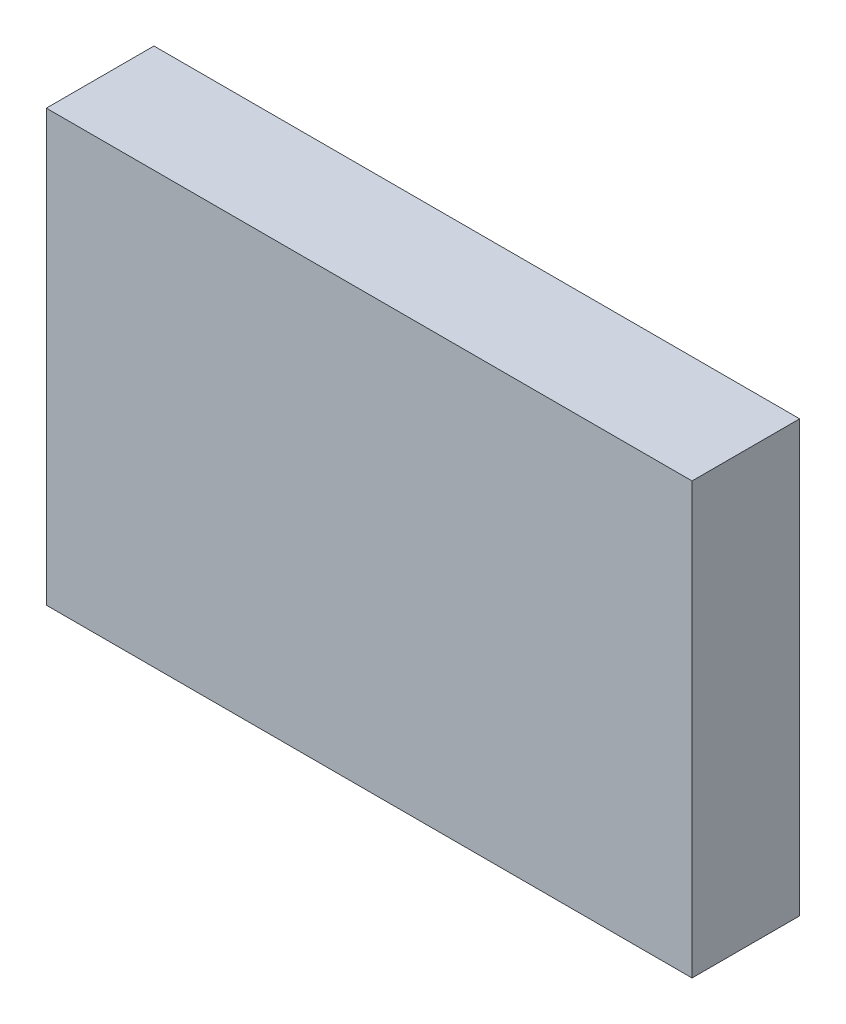
ISO-10303-21;
HEADER;
FILE_DESCRIPTION(('STEP AP214'),'2;1');
FILE_NAME('part.step','',(''),(''),'','','');
FILE_SCHEMA(('AUTOMOTIVE_DESIGN { 1 0 10303 214 1 1 1 1 }'));
ENDSEC;
DATA;
#1=APPLICATION_CONTEXT('core data for automotive mechanical design processes');
#2=APPLICATION_PROTOCOL_DEFINITION('international standard','automotive_design',2000,#1);
#3=PRODUCT_CONTEXT('',#1,'mechanical');
#4=PRODUCT('Part','Part','',(#3));
#5=PRODUCT_RELATED_PRODUCT_CATEGORY('part','',(#4));
#6=PRODUCT_DEFINITION_FORMATION('','',#4);
#7=PRODUCT_DEFINITION_CONTEXT('part definition',#1,'design');
#8=PRODUCT_DEFINITION('design','',#6,#7);
#9=PRODUCT_DEFINITION_SHAPE('','',#8);
#10=(LENGTH_UNIT() NAMED_UNIT(*) SI_UNIT(.MILLI.,.METRE.));
#11=(NAMED_UNIT(*) PLANE_ANGLE_UNIT() SI_UNIT($,.RADIAN.));
#12=(NAMED_UNIT(*) SI_UNIT($,.STERADIAN.) SOLID_ANGLE_UNIT());
#13=UNCERTAINTY_MEASURE_WITH_UNIT(LENGTH_MEASURE(1.E-05),#10,'distance_accuracy_value','');
#14=(GEOMETRIC_REPRESENTATION_CONTEXT(3) GLOBAL_UNCERTAINTY_ASSIGNED_CONTEXT((#13)) GLOBAL_UNIT_ASSIGNED_CONTEXT((#10,
#11,#12)) REPRESENTATION_CONTEXT('',''));
#15=CARTESIAN_POINT('',(0.,0.,0.));
#16=DIRECTION('',(0.,0.,1.));
#17=DIRECTION('',(1.,0.,0.));
#18=AXIS2_PLACEMENT_3D('',#15,#16,#17);
#19=CARTESIAN_POINT('',(-15.,-10.,22.));
#20=DIRECTION('',(1.,0.,0.));
#21=DIRECTION('',(0.,0.,-1.));
#22=AXIS2_PLACEMENT_3D('',#19,#20,#21);
#23=PLANE('',#22);
#24=DIRECTION('',(0.,-1.,0.));
#25=VECTOR('',#24,1.);
#26=CARTESIAN_POINT('',(-15.,-10.,17.));
#27=LINE('',#26,#25);
#28=CARTESIAN_POINT('',(-15.,9.99999999999999,17.));
#29=VERTEX_POINT('',#28);
#30=CARTESIAN_POINT('',(-15.,-10.,17.));
#31=VERTEX_POINT('',#30);
#32=EDGE_CURVE('E107',#29,#31,#27,.T.);
#33=ORIENTED_EDGE('',*,*,#32,.T.);
#34=DIRECTION('',(0.,0.,-1.));
#35=VECTOR('',#34,1.);
#36=CARTESIAN_POINT('',(-15.,-10.,22.));
#37=LINE('',#36,#35);
#38=CARTESIAN_POINT('',(-15.,-10.,22.));
#39=VERTEX_POINT('',#38);
#40=EDGE_CURVE('E11',#39,#31,#37,.T.);
#41=ORIENTED_EDGE('',*,*,#40,.F.);
#42=DIRECTION('',(0.,-1.,0.));
#43=VECTOR('',#42,1.);
#44=CARTESIAN_POINT('',(-15.,-10.,22.));
#45=LINE('',#44,#43);
#46=CARTESIAN_POINT('',(-15.,9.99999999999999,22.));
#47=VERTEX_POINT('',#46);
#48=EDGE_CURVE('E91',#47,#39,#45,.T.);
#49=ORIENTED_EDGE('',*,*,#48,.F.);
#50=DIRECTION('',(0.,0.,-1.));
#51=VECTOR('',#50,1.);
#52=CARTESIAN_POINT('',(-15.,9.99999999999999,22.));
#53=LINE('',#52,#51);
#54=EDGE_CURVE('E103',#47,#29,#53,.T.);
#55=ORIENTED_EDGE('',*,*,#54,.T.);
#56=EDGE_LOOP('',(#33,#41,#49,#55));
#57=FACE_BOUND('',#56,.T.);
#58=ADVANCED_FACE('F39',(#57),#23,.F.);
#59=CARTESIAN_POINT('',(15.,-10.,22.));
#60=DIRECTION('',(0.,1.,0.));
#61=DIRECTION('',(-1.,0.,0.));
#62=AXIS2_PLACEMENT_3D('',#59,#60,#61);
#63=PLANE('',#62);
#64=DIRECTION('',(1.,0.,0.));
#65=VECTOR('',#64,1.);
#66=CARTESIAN_POINT('',(15.,-10.,17.));
#67=LINE('',#66,#65);
#68=CARTESIAN_POINT('',(15.,-10.,17.));
#69=VERTEX_POINT('',#68);
#70=EDGE_CURVE('E96',#31,#69,#67,.T.);
#71=ORIENTED_EDGE('',*,*,#70,.T.);
#72=DIRECTION('',(0.,0.,-1.));
#73=VECTOR('',#72,1.);
#74=CARTESIAN_POINT('',(15.,-10.,22.));
#75=LINE('',#74,#73);
#76=CARTESIAN_POINT('',(15.,-10.,22.));
#77=VERTEX_POINT('',#76);
#78=EDGE_CURVE('E48',#77,#69,#75,.T.);
#79=ORIENTED_EDGE('',*,*,#78,.F.);
#80=DIRECTION('',(1.,0.,0.));
#81=VECTOR('',#80,1.);
#82=CARTESIAN_POINT('',(15.,-10.,22.));
#83=LINE('',#82,#81);
#84=EDGE_CURVE('E86',#39,#77,#83,.T.);
#85=ORIENTED_EDGE('',*,*,#84,.F.);
#86=ORIENTED_EDGE('',*,*,#40,.T.);
#87=EDGE_LOOP('',(#71,#79,#85,#86));
#88=FACE_BOUND('',#87,.T.);
#89=ADVANCED_FACE('F95',(#88),#63,.F.);
#90=CARTESIAN_POINT('',(15.,-10.,22.));
#91=DIRECTION('',(-1.,0.,0.));
#92=DIRECTION('',(0.,0.,1.));
#93=AXIS2_PLACEMENT_3D('',#90,#91,#92);
#94=PLANE('',#93);
#95=DIRECTION('',(0.,1.,0.));
#96=VECTOR('',#95,1.);
#97=CARTESIAN_POINT('',(15.,-10.,17.));
#98=LINE('',#97,#96);
#99=CARTESIAN_POINT('',(15.,10.,17.));
#100=VERTEX_POINT('',#99);
#101=EDGE_CURVE('E73',#69,#100,#98,.T.);
#102=ORIENTED_EDGE('',*,*,#101,.T.);
#103=DIRECTION('',(0.,0.,-1.));
#104=VECTOR('',#103,1.);
#105=CARTESIAN_POINT('',(15.,10.,22.));
#106=LINE('',#105,#104);
#107=CARTESIAN_POINT('',(15.,10.,22.));
#108=VERTEX_POINT('',#107);
#109=EDGE_CURVE('E98',#108,#100,#106,.T.);
#110=ORIENTED_EDGE('',*,*,#109,.F.);
#111=DIRECTION('',(0.,1.,0.));
#112=VECTOR('',#111,1.);
#113=CARTESIAN_POINT('',(15.,-10.,22.));
#114=LINE('',#113,#112);
#115=EDGE_CURVE('E89',#77,#108,#114,.T.);
#116=ORIENTED_EDGE('',*,*,#115,.F.);
#117=ORIENTED_EDGE('',*,*,#78,.T.);
#118=EDGE_LOOP('',(#102,#110,#116,#117));
#119=FACE_BOUND('',#118,.T.);
#120=ADVANCED_FACE('F99',(#119),#94,.F.);
#121=CARTESIAN_POINT('',(15.,10.,22.));
#122=DIRECTION('',(0.,-1.,0.));
#123=DIRECTION('',(1.,0.,0.));
#124=AXIS2_PLACEMENT_3D('',#121,#122,#123);
#125=PLANE('',#124);
#126=DIRECTION('',(-1.,0.,0.));
#127=VECTOR('',#126,1.);
#128=CARTESIAN_POINT('',(15.,10.,17.));
#129=LINE('',#128,#127);
#130=EDGE_CURVE('E79',#100,#29,#129,.T.);
#131=ORIENTED_EDGE('',*,*,#130,.T.);
#132=ORIENTED_EDGE('',*,*,#54,.F.);
#133=DIRECTION('',(-1.,0.,0.));
#134=VECTOR('',#133,1.);
#135=CARTESIAN_POINT('',(15.,10.,22.));
#136=LINE('',#135,#134);
#137=EDGE_CURVE('E56',#108,#47,#136,.T.);
#138=ORIENTED_EDGE('',*,*,#137,.F.);
#139=ORIENTED_EDGE('',*,*,#109,.T.);
#140=EDGE_LOOP('',(#131,#132,#138,#139));
#141=FACE_BOUND('',#140,.T.);
#142=ADVANCED_FACE('F120',(#141),#125,.F.);
#143=CARTESIAN_POINT('',(0.,0.,22.));
#144=DIRECTION('',(0.,0.,1.));
#145=DIRECTION('',(1.,0.,0.));
#146=AXIS2_PLACEMENT_3D('',#143,#144,#145);
#147=PLANE('',#146);
#148=ORIENTED_EDGE('',*,*,#48,.T.);
#149=ORIENTED_EDGE('',*,*,#84,.T.);
#150=ORIENTED_EDGE('',*,*,#115,.T.);
#151=ORIENTED_EDGE('',*,*,#137,.T.);
#152=EDGE_LOOP('',(#148,#149,#150,#151));
#153=FACE_BOUND('',#152,.T.);
#154=ADVANCED_FACE('F87',(#153),#147,.T.);
#155=CARTESIAN_POINT('',(0.,0.,17.));
#156=DIRECTION('',(0.,0.,1.));
#157=DIRECTION('',(1.,0.,0.));
#158=AXIS2_PLACEMENT_3D('',#155,#156,#157);
#159=PLANE('',#158);
#160=ORIENTED_EDGE('',*,*,#32,.F.);
#161=ORIENTED_EDGE('',*,*,#130,.F.);
#162=ORIENTED_EDGE('',*,*,#101,.F.);
#163=ORIENTED_EDGE('',*,*,#70,.F.);
#164=EDGE_LOOP('',(#160,#161,#162,#163));
#165=FACE_BOUND('',#164,.T.);
#166=ADVANCED_FACE('F123',(#165),#159,.F.);
#167=CLOSED_SHELL('',(#58,#89,#120,#142,#154,#166));
#168=MANIFOLD_SOLID_BREP('B2',#167);
#169=ADVANCED_BREP_SHAPE_REPRESENTATION('',(#18,#168),#14);
#170=SHAPE_DEFINITION_REPRESENTATION(#9,#169);
ENDSEC;
END-ISO-10303-21;
